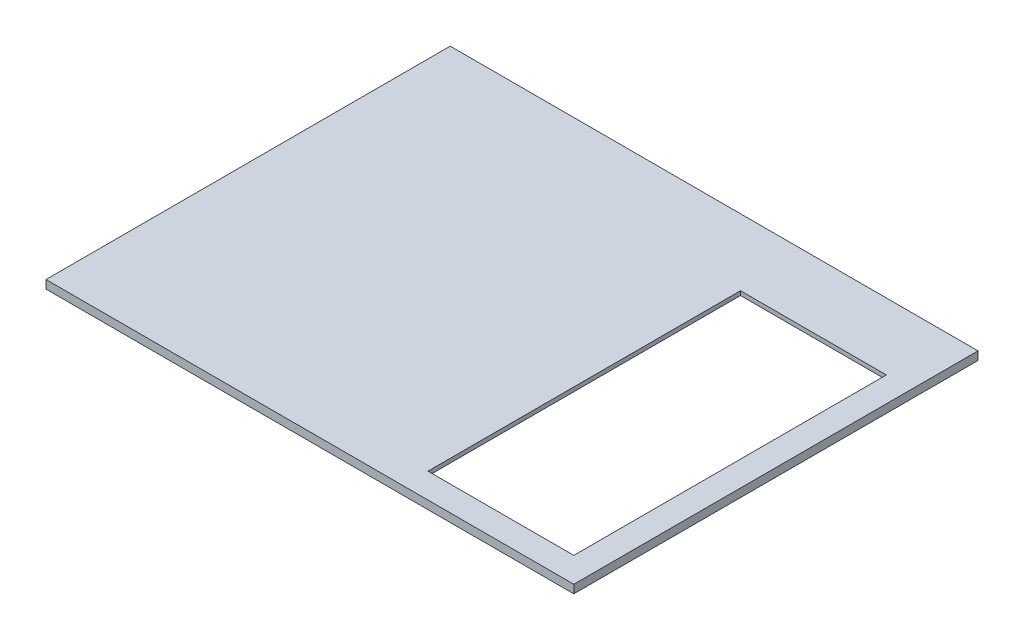
ISO-10303-21;
HEADER;
FILE_DESCRIPTION(('STEP AP214'),'2;1');
FILE_NAME('part.step','',(''),(''),'','','');
FILE_SCHEMA(('AUTOMOTIVE_DESIGN { 1 0 10303 214 1 1 1 1 }'));
ENDSEC;
DATA;
#1=APPLICATION_CONTEXT('core data for automotive mechanical design processes');
#2=APPLICATION_PROTOCOL_DEFINITION('international standard','automotive_design',2000,#1);
#3=PRODUCT_CONTEXT('',#1,'mechanical');
#4=PRODUCT('Part','Part','',(#3));
#5=PRODUCT_RELATED_PRODUCT_CATEGORY('part','',(#4));
#6=PRODUCT_DEFINITION_FORMATION('','',#4);
#7=PRODUCT_DEFINITION_CONTEXT('part definition',#1,'design');
#8=PRODUCT_DEFINITION('design','',#6,#7);
#9=PRODUCT_DEFINITION_SHAPE('','',#8);
#10=(LENGTH_UNIT() NAMED_UNIT(*) SI_UNIT(.MILLI.,.METRE.));
#11=(NAMED_UNIT(*) PLANE_ANGLE_UNIT() SI_UNIT($,.RADIAN.));
#12=(NAMED_UNIT(*) SI_UNIT($,.STERADIAN.) SOLID_ANGLE_UNIT());
#13=UNCERTAINTY_MEASURE_WITH_UNIT(LENGTH_MEASURE(1.E-05),#10,'distance_accuracy_value','');
#14=(GEOMETRIC_REPRESENTATION_CONTEXT(3) GLOBAL_UNCERTAINTY_ASSIGNED_CONTEXT((#13)) GLOBAL_UNIT_ASSIGNED_CONTEXT((#10,
#11,#12)) REPRESENTATION_CONTEXT('',''));
#15=CARTESIAN_POINT('',(0.,0.,0.));
#16=DIRECTION('',(0.,0.,1.));
#17=DIRECTION('',(1.,0.,0.));
#18=AXIS2_PLACEMENT_3D('',#15,#16,#17);
#19=CARTESIAN_POINT('',(-190.,3.,-145.5));
#20=DIRECTION('',(1.,0.,0.));
#21=DIRECTION('',(0.,0.,-1.));
#22=AXIS2_PLACEMENT_3D('',#19,#20,#21);
#23=PLANE('',#22);
#24=DIRECTION('',(0.,-1.,0.));
#25=VECTOR('',#24,1.);
#26=CARTESIAN_POINT('',(-190.,3.,-145.5));
#27=LINE('',#26,#25);
#28=CARTESIAN_POINT('',(-190.,3.,-145.5));
#29=VERTEX_POINT('',#28);
#30=CARTESIAN_POINT('',(-190.,-3.,-145.5));
#31=VERTEX_POINT('',#30);
#32=EDGE_CURVE('E204',#29,#31,#27,.T.);
#33=ORIENTED_EDGE('',*,*,#32,.T.);
#34=DIRECTION('',(0.,0.,-1.));
#35=VECTOR('',#34,1.);
#36=CARTESIAN_POINT('',(-190.,-3.,0.));
#37=LINE('',#36,#35);
#38=CARTESIAN_POINT('',(-190.,-3.,145.5));
#39=VERTEX_POINT('',#38);
#40=EDGE_CURVE('E173',#39,#31,#37,.T.);
#41=ORIENTED_EDGE('',*,*,#40,.F.);
#42=DIRECTION('',(0.,-1.,0.));
#43=VECTOR('',#42,1.);
#44=CARTESIAN_POINT('',(-190.,3.,145.5));
#45=LINE('',#44,#43);
#46=CARTESIAN_POINT('',(-190.,3.,145.5));
#47=VERTEX_POINT('',#46);
#48=EDGE_CURVE('E11',#47,#39,#45,.T.);
#49=ORIENTED_EDGE('',*,*,#48,.F.);
#50=DIRECTION('',(0.,0.,1.));
#51=VECTOR('',#50,1.);
#52=CARTESIAN_POINT('',(-190.,3.,-145.5));
#53=LINE('',#52,#51);
#54=EDGE_CURVE('E195',#29,#47,#53,.T.);
#55=ORIENTED_EDGE('',*,*,#54,.F.);
#56=EDGE_LOOP('',(#33,#41,#49,#55));
#57=FACE_BOUND('',#56,.T.);
#58=ADVANCED_FACE('F41',(#57),#23,.F.);
#59=CARTESIAN_POINT('',(190.,3.,145.5));
#60=DIRECTION('',(0.,0.,-1.));
#61=DIRECTION('',(-1.,0.,0.));
#62=AXIS2_PLACEMENT_3D('',#59,#60,#61);
#63=PLANE('',#62);
#64=ORIENTED_EDGE('',*,*,#48,.T.);
#65=DIRECTION('',(-1.,0.,0.));
#66=VECTOR('',#65,1.);
#67=CARTESIAN_POINT('',(0.,-3.,145.5));
#68=LINE('',#67,#66);
#69=CARTESIAN_POINT('',(190.,-3.,145.5));
#70=VERTEX_POINT('',#69);
#71=EDGE_CURVE('E170',#70,#39,#68,.T.);
#72=ORIENTED_EDGE('',*,*,#71,.F.);
#73=DIRECTION('',(0.,-1.,0.));
#74=VECTOR('',#73,1.);
#75=CARTESIAN_POINT('',(190.,3.,145.5));
#76=LINE('',#75,#74);
#77=CARTESIAN_POINT('',(190.,3.,145.5));
#78=VERTEX_POINT('',#77);
#79=EDGE_CURVE('E48',#78,#70,#76,.T.);
#80=ORIENTED_EDGE('',*,*,#79,.F.);
#81=DIRECTION('',(1.,0.,0.));
#82=VECTOR('',#81,1.);
#83=CARTESIAN_POINT('',(190.,3.,145.5));
#84=LINE('',#83,#82);
#85=EDGE_CURVE('E198',#47,#78,#84,.T.);
#86=ORIENTED_EDGE('',*,*,#85,.F.);
#87=EDGE_LOOP('',(#64,#72,#80,#86));
#88=FACE_BOUND('',#87,.T.);
#89=ADVANCED_FACE('F218',(#88),#63,.F.);
#90=CARTESIAN_POINT('',(190.,3.,-145.5));
#91=DIRECTION('',(-1.,0.,0.));
#92=DIRECTION('',(0.,0.,1.));
#93=AXIS2_PLACEMENT_3D('',#90,#91,#92);
#94=PLANE('',#93);
#95=ORIENTED_EDGE('',*,*,#79,.T.);
#96=DIRECTION('',(0.,0.,1.));
#97=VECTOR('',#96,1.);
#98=CARTESIAN_POINT('',(190.,-3.,0.));
#99=LINE('',#98,#97);
#100=CARTESIAN_POINT('',(190.,-3.,-145.5));
#101=VERTEX_POINT('',#100);
#102=EDGE_CURVE('E134',#101,#70,#99,.T.);
#103=ORIENTED_EDGE('',*,*,#102,.F.);
#104=DIRECTION('',(0.,-1.,0.));
#105=VECTOR('',#104,1.);
#106=CARTESIAN_POINT('',(190.,3.,-145.5));
#107=LINE('',#106,#105);
#108=CARTESIAN_POINT('',(190.,3.,-145.5));
#109=VERTEX_POINT('',#108);
#110=EDGE_CURVE('E206',#109,#101,#107,.T.);
#111=ORIENTED_EDGE('',*,*,#110,.F.);
#112=DIRECTION('',(0.,0.,-1.));
#113=VECTOR('',#112,1.);
#114=CARTESIAN_POINT('',(190.,3.,-145.5));
#115=LINE('',#114,#113);
#116=EDGE_CURVE('E200',#78,#109,#115,.T.);
#117=ORIENTED_EDGE('',*,*,#116,.F.);
#118=EDGE_LOOP('',(#95,#103,#111,#117));
#119=FACE_BOUND('',#118,.T.);
#120=ADVANCED_FACE('F211',(#119),#94,.F.);
#121=CARTESIAN_POINT('',(190.,3.,-145.5));
#122=DIRECTION('',(0.,0.,1.));
#123=DIRECTION('',(1.,0.,0.));
#124=AXIS2_PLACEMENT_3D('',#121,#122,#123);
#125=PLANE('',#124);
#126=ORIENTED_EDGE('',*,*,#110,.T.);
#127=DIRECTION('',(1.,0.,0.));
#128=VECTOR('',#127,1.);
#129=CARTESIAN_POINT('',(0.,-3.,-145.5));
#130=LINE('',#129,#128);
#131=EDGE_CURVE('E176',#31,#101,#130,.T.);
#132=ORIENTED_EDGE('',*,*,#131,.F.);
#133=ORIENTED_EDGE('',*,*,#32,.F.);
#134=DIRECTION('',(-1.,0.,0.));
#135=VECTOR('',#134,1.);
#136=CARTESIAN_POINT('',(190.,3.,-145.5));
#137=LINE('',#136,#135);
#138=EDGE_CURVE('E202',#109,#29,#137,.T.);
#139=ORIENTED_EDGE('',*,*,#138,.F.);
#140=EDGE_LOOP('',(#126,#132,#133,#139));
#141=FACE_BOUND('',#140,.T.);
#142=ADVANCED_FACE('F225',(#141),#125,.F.);
#143=CARTESIAN_POINT('',(0.,3.,0.));
#144=DIRECTION('',(0.,-1.,0.));
#145=DIRECTION('',(0.,0.,-1.));
#146=AXIS2_PLACEMENT_3D('',#143,#144,#145);
#147=PLANE('',#146);
#148=DIRECTION('',(1.,0.,0.));
#149=VECTOR('',#148,1.);
#150=CARTESIAN_POINT('',(172.,3.,-97.5));
#151=LINE('',#150,#149);
#152=CARTESIAN_POINT('',(67.,3.,-97.5000000000001));
#153=VERTEX_POINT('',#152);
#154=CARTESIAN_POINT('',(172.,3.,-97.5));
#155=VERTEX_POINT('',#154);
#156=EDGE_CURVE('E146',#153,#155,#151,.T.);
#157=ORIENTED_EDGE('',*,*,#156,.T.);
#158=DIRECTION('',(0.,0.,1.));
#159=VECTOR('',#158,1.);
#160=CARTESIAN_POINT('',(172.,3.,127.5));
#161=LINE('',#160,#159);
#162=CARTESIAN_POINT('',(172.,3.,127.5));
#163=VERTEX_POINT('',#162);
#164=EDGE_CURVE('E127',#155,#163,#161,.T.);
#165=ORIENTED_EDGE('',*,*,#164,.T.);
#166=DIRECTION('',(-1.,0.,0.));
#167=VECTOR('',#166,1.);
#168=CARTESIAN_POINT('',(172.,3.,127.5));
#169=LINE('',#168,#167);
#170=CARTESIAN_POINT('',(67.,3.,127.5));
#171=VERTEX_POINT('',#170);
#172=EDGE_CURVE('E137',#163,#171,#169,.T.);
#173=ORIENTED_EDGE('',*,*,#172,.T.);
#174=DIRECTION('',(0.,0.,-1.));
#175=VECTOR('',#174,1.);
#176=CARTESIAN_POINT('',(67.,3.,127.5));
#177=LINE('',#176,#175);
#178=EDGE_CURVE('E60',#171,#153,#177,.T.);
#179=ORIENTED_EDGE('',*,*,#178,.T.);
#180=EDGE_LOOP('',(#157,#165,#173,#179));
#181=FACE_BOUND('',#180,.T.);
#182=ORIENTED_EDGE('',*,*,#54,.T.);
#183=ORIENTED_EDGE('',*,*,#85,.T.);
#184=ORIENTED_EDGE('',*,*,#116,.T.);
#185=ORIENTED_EDGE('',*,*,#138,.T.);
#186=EDGE_LOOP('',(#182,#183,#184,#185));
#187=FACE_BOUND('',#186,.T.);
#188=ADVANCED_FACE('F143',(#181,#187),#147,.F.);
#189=CARTESIAN_POINT('',(172.,-3.,0.));
#190=DIRECTION('',(-1.,0.,0.));
#191=DIRECTION('',(0.,0.,1.));
#192=AXIS2_PLACEMENT_3D('',#189,#190,#191);
#193=PLANE('',#192);
#194=DIRECTION('',(0.,0.,1.));
#195=VECTOR('',#194,1.);
#196=CARTESIAN_POINT('',(172.,0.,0.));
#197=LINE('',#196,#195);
#198=CARTESIAN_POINT('',(172.,0.,-127.5));
#199=VERTEX_POINT('',#198);
#200=CARTESIAN_POINT('',(172.,0.,-97.5));
#201=VERTEX_POINT('',#200);
#202=EDGE_CURVE('E157',#199,#201,#197,.T.);
#203=ORIENTED_EDGE('',*,*,#202,.F.);
#204=DIRECTION('',(0.,1.,0.));
#205=VECTOR('',#204,1.);
#206=CARTESIAN_POINT('',(172.,-3.,-127.5));
#207=LINE('',#206,#205);
#208=CARTESIAN_POINT('',(172.,-3.,-127.5));
#209=VERTEX_POINT('',#208);
#210=EDGE_CURVE('E193',#209,#199,#207,.T.);
#211=ORIENTED_EDGE('',*,*,#210,.F.);
#212=DIRECTION('',(0.,0.,1.));
#213=VECTOR('',#212,1.);
#214=CARTESIAN_POINT('',(172.,-3.,0.));
#215=LINE('',#214,#213);
#216=CARTESIAN_POINT('',(172.,-3.,127.5));
#217=VERTEX_POINT('',#216);
#218=EDGE_CURVE('E130',#209,#217,#215,.T.);
#219=ORIENTED_EDGE('',*,*,#218,.T.);
#220=DIRECTION('',(0.,1.,0.));
#221=VECTOR('',#220,1.);
#222=CARTESIAN_POINT('',(172.,-3.,127.5));
#223=LINE('',#222,#221);
#224=EDGE_CURVE('E122',#217,#163,#223,.T.);
#225=ORIENTED_EDGE('',*,*,#224,.T.);
#226=ORIENTED_EDGE('',*,*,#164,.F.);
#227=DIRECTION('',(0.,-1.,0.));
#228=VECTOR('',#227,1.);
#229=CARTESIAN_POINT('',(172.,3.,-97.5));
#230=LINE('',#229,#228);
#231=EDGE_CURVE('E155',#155,#201,#230,.T.);
#232=ORIENTED_EDGE('',*,*,#231,.T.);
#233=EDGE_LOOP('',(#203,#211,#219,#225,#226,#232));
#234=FACE_BOUND('',#233,.T.);
#235=ADVANCED_FACE('F125',(#234),#193,.T.);
#236=CARTESIAN_POINT('',(0.,-3.,-127.5));
#237=DIRECTION('',(0.,0.,1.));
#238=DIRECTION('',(1.,0.,0.));
#239=AXIS2_PLACEMENT_3D('',#236,#237,#238);
#240=PLANE('',#239);
#241=DIRECTION('',(1.,0.,0.));
#242=VECTOR('',#241,1.);
#243=CARTESIAN_POINT('',(0.,0.,-127.5));
#244=LINE('',#243,#242);
#245=CARTESIAN_POINT('',(-172.,0.,-127.5));
#246=VERTEX_POINT('',#245);
#247=EDGE_CURVE('E183',#246,#199,#244,.T.);
#248=ORIENTED_EDGE('',*,*,#247,.F.);
#249=DIRECTION('',(0.,1.,0.));
#250=VECTOR('',#249,1.);
#251=CARTESIAN_POINT('',(-172.,-3.,-127.5));
#252=LINE('',#251,#250);
#253=CARTESIAN_POINT('',(-172.,-3.,-127.5));
#254=VERTEX_POINT('',#253);
#255=EDGE_CURVE('E191',#254,#246,#252,.T.);
#256=ORIENTED_EDGE('',*,*,#255,.F.);
#257=DIRECTION('',(1.,0.,0.));
#258=VECTOR('',#257,1.);
#259=CARTESIAN_POINT('',(0.,-3.,-127.5));
#260=LINE('',#259,#258);
#261=EDGE_CURVE('E162',#254,#209,#260,.T.);
#262=ORIENTED_EDGE('',*,*,#261,.T.);
#263=ORIENTED_EDGE('',*,*,#210,.T.);
#264=EDGE_LOOP('',(#248,#256,#262,#263));
#265=FACE_BOUND('',#264,.T.);
#266=ADVANCED_FACE('F233',(#265),#240,.T.);
#267=CARTESIAN_POINT('',(-172.,-3.,0.));
#268=DIRECTION('',(-1.,0.,0.));
#269=DIRECTION('',(0.,0.,1.));
#270=AXIS2_PLACEMENT_3D('',#267,#268,#269);
#271=PLANE('',#270);
#272=DIRECTION('',(0.,0.,1.));
#273=VECTOR('',#272,1.);
#274=CARTESIAN_POINT('',(-172.,0.,0.));
#275=LINE('',#274,#273);
#276=CARTESIAN_POINT('',(-172.,0.,127.5));
#277=VERTEX_POINT('',#276);
#278=EDGE_CURVE('E186',#246,#277,#275,.T.);
#279=ORIENTED_EDGE('',*,*,#278,.T.);
#280=DIRECTION('',(0.,1.,0.));
#281=VECTOR('',#280,1.);
#282=CARTESIAN_POINT('',(-172.,-3.,127.5));
#283=LINE('',#282,#281);
#284=CARTESIAN_POINT('',(-172.,-3.,127.5));
#285=VERTEX_POINT('',#284);
#286=EDGE_CURVE('E133',#285,#277,#283,.T.);
#287=ORIENTED_EDGE('',*,*,#286,.F.);
#288=DIRECTION('',(0.,0.,1.));
#289=VECTOR('',#288,1.);
#290=CARTESIAN_POINT('',(-172.,-3.,0.));
#291=LINE('',#290,#289);
#292=EDGE_CURVE('E166',#254,#285,#291,.T.);
#293=ORIENTED_EDGE('',*,*,#292,.F.);
#294=ORIENTED_EDGE('',*,*,#255,.T.);
#295=EDGE_LOOP('',(#279,#287,#293,#294));
#296=FACE_BOUND('',#295,.T.);
#297=ADVANCED_FACE('F264',(#296),#271,.F.);
#298=CARTESIAN_POINT('',(0.,-3.,127.5));
#299=DIRECTION('',(0.,0.,1.));
#300=DIRECTION('',(1.,0.,0.));
#301=AXIS2_PLACEMENT_3D('',#298,#299,#300);
#302=PLANE('',#301);
#303=DIRECTION('',(1.,0.,0.));
#304=VECTOR('',#303,1.);
#305=CARTESIAN_POINT('',(0.,0.,127.5));
#306=LINE('',#305,#304);
#307=CARTESIAN_POINT('',(67.,0.,127.5));
#308=VERTEX_POINT('',#307);
#309=EDGE_CURVE('E163',#277,#308,#306,.T.);
#310=ORIENTED_EDGE('',*,*,#309,.T.);
#311=DIRECTION('',(0.,-1.,0.));
#312=VECTOR('',#311,1.);
#313=CARTESIAN_POINT('',(67.,3.,127.5));
#314=LINE('',#313,#312);
#315=EDGE_CURVE('E140',#171,#308,#314,.T.);
#316=ORIENTED_EDGE('',*,*,#315,.F.);
#317=ORIENTED_EDGE('',*,*,#172,.F.);
#318=ORIENTED_EDGE('',*,*,#224,.F.);
#319=DIRECTION('',(1.,0.,0.));
#320=VECTOR('',#319,1.);
#321=CARTESIAN_POINT('',(0.,-3.,127.5));
#322=LINE('',#321,#320);
#323=EDGE_CURVE('E168',#285,#217,#322,.T.);
#324=ORIENTED_EDGE('',*,*,#323,.F.);
#325=ORIENTED_EDGE('',*,*,#286,.T.);
#326=EDGE_LOOP('',(#310,#316,#317,#318,#324,#325));
#327=FACE_BOUND('',#326,.T.);
#328=ADVANCED_FACE('F139',(#327),#302,.F.);
#329=CARTESIAN_POINT('',(0.,-3.,0.));
#330=DIRECTION('',(0.,-1.,0.));
#331=DIRECTION('',(0.,0.,-1.));
#332=AXIS2_PLACEMENT_3D('',#329,#330,#331);
#333=PLANE('',#332);
#334=ORIENTED_EDGE('',*,*,#218,.F.);
#335=ORIENTED_EDGE('',*,*,#261,.F.);
#336=ORIENTED_EDGE('',*,*,#292,.T.);
#337=ORIENTED_EDGE('',*,*,#323,.T.);
#338=EDGE_LOOP('',(#334,#335,#336,#337));
#339=FACE_BOUND('',#338,.T.);
#340=ORIENTED_EDGE('',*,*,#71,.T.);
#341=ORIENTED_EDGE('',*,*,#40,.T.);
#342=ORIENTED_EDGE('',*,*,#131,.T.);
#343=ORIENTED_EDGE('',*,*,#102,.T.);
#344=EDGE_LOOP('',(#340,#341,#342,#343));
#345=FACE_BOUND('',#344,.T.);
#346=ADVANCED_FACE('F216',(#339,#345),#333,.T.);
#347=CARTESIAN_POINT('',(0.,0.,0.));
#348=DIRECTION('',(0.,-1.,0.));
#349=DIRECTION('',(0.,0.,-1.));
#350=AXIS2_PLACEMENT_3D('',#347,#348,#349);
#351=PLANE('',#350);
#352=DIRECTION('',(0.,0.,-1.));
#353=VECTOR('',#352,1.);
#354=CARTESIAN_POINT('',(67.,0.,127.5));
#355=LINE('',#354,#353);
#356=CARTESIAN_POINT('',(67.,0.,-97.5000000000001));
#357=VERTEX_POINT('',#356);
#358=EDGE_CURVE('E55',#308,#357,#355,.T.);
#359=ORIENTED_EDGE('',*,*,#358,.F.);
#360=ORIENTED_EDGE('',*,*,#309,.F.);
#361=ORIENTED_EDGE('',*,*,#278,.F.);
#362=ORIENTED_EDGE('',*,*,#247,.T.);
#363=ORIENTED_EDGE('',*,*,#202,.T.);
#364=DIRECTION('',(1.,0.,0.));
#365=VECTOR('',#364,1.);
#366=CARTESIAN_POINT('',(172.,0.,-97.5));
#367=LINE('',#366,#365);
#368=EDGE_CURVE('E147',#357,#201,#367,.T.);
#369=ORIENTED_EDGE('',*,*,#368,.F.);
#370=EDGE_LOOP('',(#359,#360,#361,#362,#363,#369));
#371=FACE_BOUND('',#370,.T.);
#372=ADVANCED_FACE('F245',(#371),#351,.T.);
#373=CARTESIAN_POINT('',(172.,3.,-97.5));
#374=DIRECTION('',(0.,0.,-1.));
#375=DIRECTION('',(-1.,0.,0.));
#376=AXIS2_PLACEMENT_3D('',#373,#374,#375);
#377=PLANE('',#376);
#378=ORIENTED_EDGE('',*,*,#368,.T.);
#379=ORIENTED_EDGE('',*,*,#231,.F.);
#380=ORIENTED_EDGE('',*,*,#156,.F.);
#381=DIRECTION('',(0.,-1.,0.));
#382=VECTOR('',#381,1.);
#383=CARTESIAN_POINT('',(67.,3.,-97.5000000000001));
#384=LINE('',#383,#382);
#385=EDGE_CURVE('E158',#153,#357,#384,.T.);
#386=ORIENTED_EDGE('',*,*,#385,.T.);
#387=EDGE_LOOP('',(#378,#379,#380,#386));
#388=FACE_BOUND('',#387,.T.);
#389=ADVANCED_FACE('F247',(#388),#377,.F.);
#390=CARTESIAN_POINT('',(67.,3.,127.5));
#391=DIRECTION('',(-1.,0.,0.));
#392=DIRECTION('',(0.,0.,1.));
#393=AXIS2_PLACEMENT_3D('',#390,#391,#392);
#394=PLANE('',#393);
#395=ORIENTED_EDGE('',*,*,#358,.T.);
#396=ORIENTED_EDGE('',*,*,#385,.F.);
#397=ORIENTED_EDGE('',*,*,#178,.F.);
#398=ORIENTED_EDGE('',*,*,#315,.T.);
#399=EDGE_LOOP('',(#395,#396,#397,#398));
#400=FACE_BOUND('',#399,.T.);
#401=ADVANCED_FACE('F253',(#400),#394,.F.);
#402=CLOSED_SHELL('',(#58,#89,#120,#142,#188,#235,#266,#297,#328,#346,#372,#389,#401));
#403=MANIFOLD_SOLID_BREP('B2',#402);
#404=ADVANCED_BREP_SHAPE_REPRESENTATION('',(#18,#403),#14);
#405=SHAPE_DEFINITION_REPRESENTATION(#9,#404);
ENDSEC;
END-ISO-10303-21;
